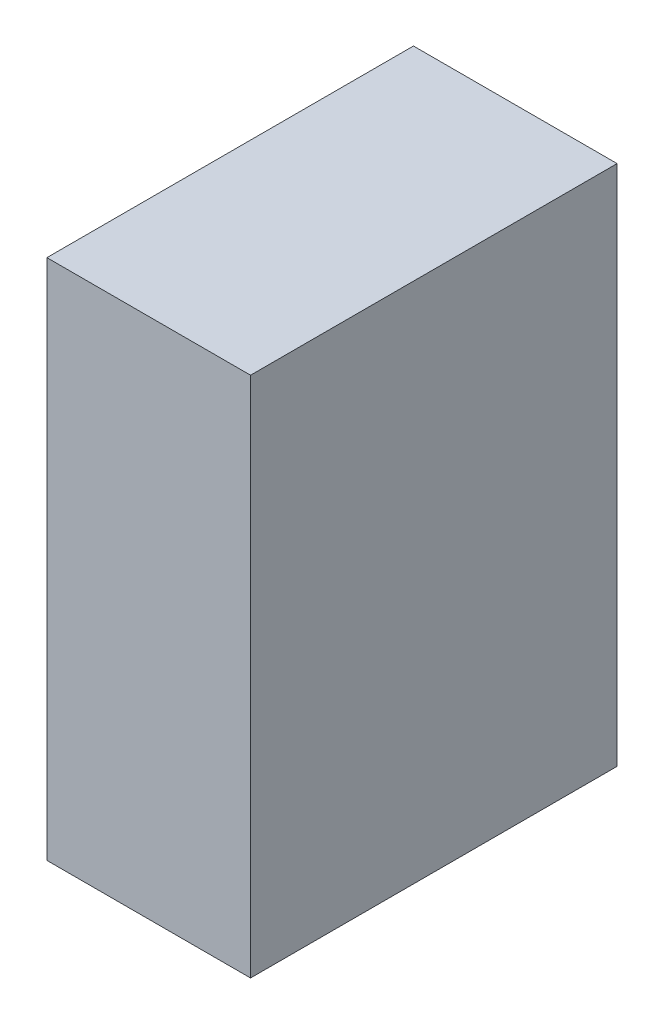
ISO-10303-21;
HEADER;
FILE_DESCRIPTION(('STEP AP214'),'2;1');
FILE_NAME('part.step','',(''),(''),'','','');
FILE_SCHEMA(('AUTOMOTIVE_DESIGN { 1 0 10303 214 1 1 1 1 }'));
ENDSEC;
DATA;
#1=APPLICATION_CONTEXT('core data for automotive mechanical design processes');
#2=APPLICATION_PROTOCOL_DEFINITION('international standard','automotive_design',2000,#1);
#3=PRODUCT_CONTEXT('',#1,'mechanical');
#4=PRODUCT('Part','Part','',(#3));
#5=PRODUCT_RELATED_PRODUCT_CATEGORY('part','',(#4));
#6=PRODUCT_DEFINITION_FORMATION('','',#4);
#7=PRODUCT_DEFINITION_CONTEXT('part definition',#1,'design');
#8=PRODUCT_DEFINITION('design','',#6,#7);
#9=PRODUCT_DEFINITION_SHAPE('','',#8);
#10=(LENGTH_UNIT() NAMED_UNIT(*) SI_UNIT(.MILLI.,.METRE.));
#11=(NAMED_UNIT(*) PLANE_ANGLE_UNIT() SI_UNIT($,.RADIAN.));
#12=(NAMED_UNIT(*) SI_UNIT($,.STERADIAN.) SOLID_ANGLE_UNIT());
#13=UNCERTAINTY_MEASURE_WITH_UNIT(LENGTH_MEASURE(1.E-05),#10,'distance_accuracy_value','');
#14=(GEOMETRIC_REPRESENTATION_CONTEXT(3) GLOBAL_UNCERTAINTY_ASSIGNED_CONTEXT((#13)) GLOBAL_UNIT_ASSIGNED_CONTEXT((#10,
#11,#12)) REPRESENTATION_CONTEXT('',''));
#15=CARTESIAN_POINT('',(0.,0.,0.));
#16=DIRECTION('',(0.,0.,1.));
#17=DIRECTION('',(1.,0.,0.));
#18=AXIS2_PLACEMENT_3D('',#15,#16,#17);
#19=CARTESIAN_POINT('',(-10.,12.8177074415897,-9.));
#20=DIRECTION('',(0.,0.,-1.));
#21=DIRECTION('',(0.,1.,0.));
#22=AXIS2_PLACEMENT_3D('',#19,#20,#21);
#23=PLANE('',#22);
#24=DIRECTION('',(0.,1.,0.));
#25=VECTOR('',#24,1.);
#26=CARTESIAN_POINT('',(0.,12.8177074415897,-9.));
#27=LINE('',#26,#25);
#28=CARTESIAN_POINT('',(0.,-12.8177074415897,-9.));
#29=VERTEX_POINT('',#28);
#30=CARTESIAN_POINT('',(0.,12.8177074415897,-9.));
#31=VERTEX_POINT('',#30);
#32=EDGE_CURVE('E95',#29,#31,#27,.T.);
#33=ORIENTED_EDGE('',*,*,#32,.F.);
#34=DIRECTION('',(1.,0.,0.));
#35=VECTOR('',#34,1.);
#36=CARTESIAN_POINT('',(-10.,-12.8177074415897,-9.));
#37=LINE('',#36,#35);
#38=CARTESIAN_POINT('',(-10.,-12.8177074415897,-9.));
#39=VERTEX_POINT('',#38);
#40=EDGE_CURVE('E11',#39,#29,#37,.T.);
#41=ORIENTED_EDGE('',*,*,#40,.F.);
#42=DIRECTION('',(0.,1.,0.));
#43=VECTOR('',#42,1.);
#44=CARTESIAN_POINT('',(-10.,12.8177074415897,-9.));
#45=LINE('',#44,#43);
#46=CARTESIAN_POINT('',(-10.,12.8177074415897,-9.));
#47=VERTEX_POINT('',#46);
#48=EDGE_CURVE('E89',#39,#47,#45,.T.);
#49=ORIENTED_EDGE('',*,*,#48,.T.);
#50=DIRECTION('',(1.,0.,0.));
#51=VECTOR('',#50,1.);
#52=CARTESIAN_POINT('',(-10.,12.8177074415897,-9.));
#53=LINE('',#52,#51);
#54=EDGE_CURVE('E34',#47,#31,#53,.T.);
#55=ORIENTED_EDGE('',*,*,#54,.T.);
#56=EDGE_LOOP('',(#33,#41,#49,#55));
#57=FACE_BOUND('',#56,.T.);
#58=ADVANCED_FACE('F31',(#57),#23,.T.);
#59=CARTESIAN_POINT('',(-10.,-12.8177074415897,9.));
#60=DIRECTION('',(0.,-1.,0.));
#61=DIRECTION('',(0.,0.,-1.));
#62=AXIS2_PLACEMENT_3D('',#59,#60,#61);
#63=PLANE('',#62);
#64=DIRECTION('',(0.,0.,-1.));
#65=VECTOR('',#64,1.);
#66=CARTESIAN_POINT('',(0.,-12.8177074415897,9.));
#67=LINE('',#66,#65);
#68=CARTESIAN_POINT('',(0.,-12.8177074415897,9.));
#69=VERTEX_POINT('',#68);
#70=EDGE_CURVE('E91',#69,#29,#67,.T.);
#71=ORIENTED_EDGE('',*,*,#70,.F.);
#72=DIRECTION('',(1.,0.,0.));
#73=VECTOR('',#72,1.);
#74=CARTESIAN_POINT('',(-10.,-12.8177074415897,9.));
#75=LINE('',#74,#73);
#76=CARTESIAN_POINT('',(-10.,-12.8177074415897,9.));
#77=VERTEX_POINT('',#76);
#78=EDGE_CURVE('E40',#77,#69,#75,.T.);
#79=ORIENTED_EDGE('',*,*,#78,.F.);
#80=DIRECTION('',(0.,0.,-1.));
#81=VECTOR('',#80,1.);
#82=CARTESIAN_POINT('',(-10.,-12.8177074415897,9.));
#83=LINE('',#82,#81);
#84=EDGE_CURVE('E86',#77,#39,#83,.T.);
#85=ORIENTED_EDGE('',*,*,#84,.T.);
#86=ORIENTED_EDGE('',*,*,#40,.T.);
#87=EDGE_LOOP('',(#71,#79,#85,#86));
#88=FACE_BOUND('',#87,.T.);
#89=ADVANCED_FACE('F105',(#88),#63,.T.);
#90=CARTESIAN_POINT('',(-10.,12.8177074415897,9.));
#91=DIRECTION('',(0.,0.,1.));
#92=DIRECTION('',(0.,-1.,0.));
#93=AXIS2_PLACEMENT_3D('',#90,#91,#92);
#94=PLANE('',#93);
#95=DIRECTION('',(0.,-1.,0.));
#96=VECTOR('',#95,1.);
#97=CARTESIAN_POINT('',(0.,12.8177074415897,9.));
#98=LINE('',#97,#96);
#99=CARTESIAN_POINT('',(0.,12.8177074415897,9.));
#100=VERTEX_POINT('',#99);
#101=EDGE_CURVE('E81',#100,#69,#98,.T.);
#102=ORIENTED_EDGE('',*,*,#101,.F.);
#103=DIRECTION('',(1.,0.,0.));
#104=VECTOR('',#103,1.);
#105=CARTESIAN_POINT('',(-10.,12.8177074415897,9.));
#106=LINE('',#105,#104);
#107=CARTESIAN_POINT('',(-10.,12.8177074415897,9.));
#108=VERTEX_POINT('',#107);
#109=EDGE_CURVE('E76',#108,#100,#106,.T.);
#110=ORIENTED_EDGE('',*,*,#109,.F.);
#111=DIRECTION('',(0.,-1.,0.));
#112=VECTOR('',#111,1.);
#113=CARTESIAN_POINT('',(-10.,12.8177074415897,9.));
#114=LINE('',#113,#112);
#115=EDGE_CURVE('E79',#108,#77,#114,.T.);
#116=ORIENTED_EDGE('',*,*,#115,.T.);
#117=ORIENTED_EDGE('',*,*,#78,.T.);
#118=EDGE_LOOP('',(#102,#110,#116,#117));
#119=FACE_BOUND('',#118,.T.);
#120=ADVANCED_FACE('F78',(#119),#94,.T.);
#121=CARTESIAN_POINT('',(-10.,12.8177074415897,9.));
#122=DIRECTION('',(0.,1.,0.));
#123=DIRECTION('',(0.,0.,1.));
#124=AXIS2_PLACEMENT_3D('',#121,#122,#123);
#125=PLANE('',#124);
#126=DIRECTION('',(0.,0.,1.));
#127=VECTOR('',#126,1.);
#128=CARTESIAN_POINT('',(0.,12.8177074415897,9.));
#129=LINE('',#128,#127);
#130=EDGE_CURVE('E98',#31,#100,#129,.T.);
#131=ORIENTED_EDGE('',*,*,#130,.F.);
#132=ORIENTED_EDGE('',*,*,#54,.F.);
#133=DIRECTION('',(0.,0.,1.));
#134=VECTOR('',#133,1.);
#135=CARTESIAN_POINT('',(-10.,12.8177074415897,9.));
#136=LINE('',#135,#134);
#137=EDGE_CURVE('E85',#47,#108,#136,.T.);
#138=ORIENTED_EDGE('',*,*,#137,.T.);
#139=ORIENTED_EDGE('',*,*,#109,.T.);
#140=EDGE_LOOP('',(#131,#132,#138,#139));
#141=FACE_BOUND('',#140,.T.);
#142=ADVANCED_FACE('F88',(#141),#125,.T.);
#143=CARTESIAN_POINT('',(-10.,-12.8177074415897,-9.));
#144=DIRECTION('',(1.,0.,0.));
#145=DIRECTION('',(0.,0.,-1.));
#146=AXIS2_PLACEMENT_3D('',#143,#144,#145);
#147=PLANE('',#146);
#148=ORIENTED_EDGE('',*,*,#48,.F.);
#149=ORIENTED_EDGE('',*,*,#84,.F.);
#150=ORIENTED_EDGE('',*,*,#115,.F.);
#151=ORIENTED_EDGE('',*,*,#137,.F.);
#152=EDGE_LOOP('',(#148,#149,#150,#151));
#153=FACE_BOUND('',#152,.T.);
#154=ADVANCED_FACE('F84',(#153),#147,.F.);
#155=CARTESIAN_POINT('',(0.,-12.8177074415897,-9.));
#156=DIRECTION('',(1.,0.,0.));
#157=DIRECTION('',(0.,0.,-1.));
#158=AXIS2_PLACEMENT_3D('',#155,#156,#157);
#159=PLANE('',#158);
#160=ORIENTED_EDGE('',*,*,#32,.T.);
#161=ORIENTED_EDGE('',*,*,#130,.T.);
#162=ORIENTED_EDGE('',*,*,#101,.T.);
#163=ORIENTED_EDGE('',*,*,#70,.T.);
#164=EDGE_LOOP('',(#160,#161,#162,#163));
#165=FACE_BOUND('',#164,.T.);
#166=ADVANCED_FACE('F104',(#165),#159,.T.);
#167=CLOSED_SHELL('',(#58,#89,#120,#142,#154,#166));
#168=MANIFOLD_SOLID_BREP('B2',#167);
#169=ADVANCED_BREP_SHAPE_REPRESENTATION('',(#18,#168),#14);
#170=SHAPE_DEFINITION_REPRESENTATION(#9,#169);
ENDSEC;
END-ISO-10303-21;
